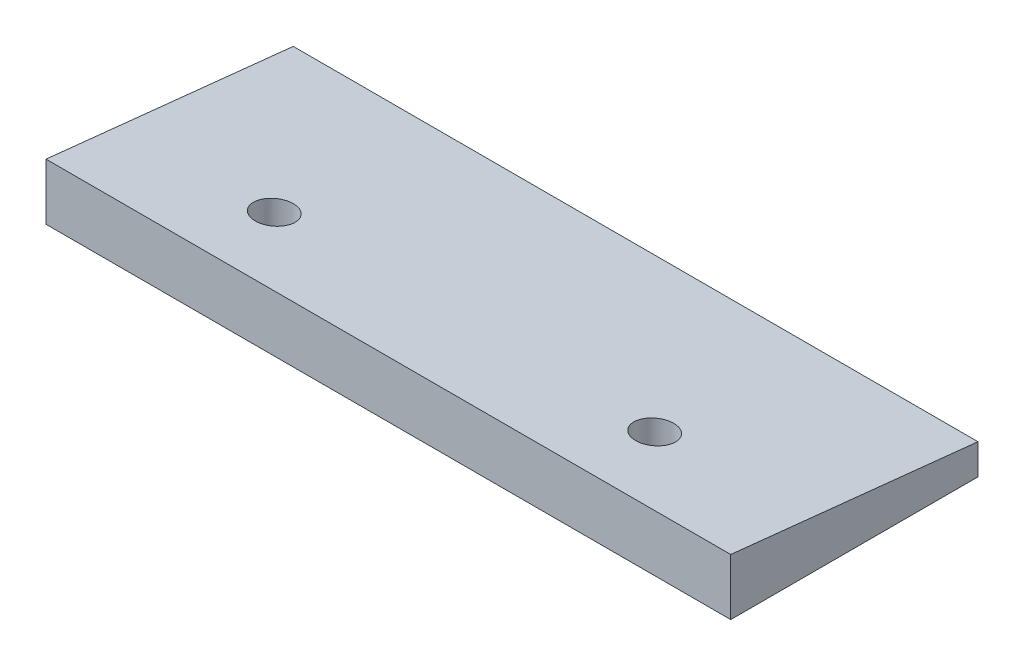
ISO-10303-21;
HEADER;
FILE_DESCRIPTION(('STEP AP214'),'2;1');
FILE_NAME('part.step','',(''),(''),'','','');
FILE_SCHEMA(('AUTOMOTIVE_DESIGN { 1 0 10303 214 1 1 1 1 }'));
ENDSEC;
DATA;
#1=APPLICATION_CONTEXT('core data for automotive mechanical design processes');
#2=APPLICATION_PROTOCOL_DEFINITION('international standard','automotive_design',2000,#1);
#3=PRODUCT_CONTEXT('',#1,'mechanical');
#4=PRODUCT('Part','Part','',(#3));
#5=PRODUCT_RELATED_PRODUCT_CATEGORY('part','',(#4));
#6=PRODUCT_DEFINITION_FORMATION('','',#4);
#7=PRODUCT_DEFINITION_CONTEXT('part definition',#1,'design');
#8=PRODUCT_DEFINITION('design','',#6,#7);
#9=PRODUCT_DEFINITION_SHAPE('','',#8);
#10=(LENGTH_UNIT() NAMED_UNIT(*) SI_UNIT(.MILLI.,.METRE.));
#11=(NAMED_UNIT(*) PLANE_ANGLE_UNIT() SI_UNIT($,.RADIAN.));
#12=(NAMED_UNIT(*) SI_UNIT($,.STERADIAN.) SOLID_ANGLE_UNIT());
#13=UNCERTAINTY_MEASURE_WITH_UNIT(LENGTH_MEASURE(1.E-05),#10,'distance_accuracy_value','');
#14=(GEOMETRIC_REPRESENTATION_CONTEXT(3) GLOBAL_UNCERTAINTY_ASSIGNED_CONTEXT((#13)) GLOBAL_UNIT_ASSIGNED_CONTEXT((#10,
#11,#12)) REPRESENTATION_CONTEXT('',''));
#15=CARTESIAN_POINT('',(0.,0.,0.));
#16=DIRECTION('',(0.,0.,1.));
#17=DIRECTION('',(1.,0.,0.));
#18=AXIS2_PLACEMENT_3D('',#15,#16,#17);
#19=CARTESIAN_POINT('',(90.,0.,65.));
#20=DIRECTION('',(0.,1.,0.));
#21=DIRECTION('',(0.,0.,1.));
#22=AXIS2_PLACEMENT_3D('',#19,#20,#21);
#23=PLANE('',#22);
#24=CARTESIAN_POINT('',(-50.,0.,45.));
#25=DIRECTION('',(0.,1.,0.));
#26=DIRECTION('',(0.,0.,1.));
#27=AXIS2_PLACEMENT_3D('',#24,#25,#26);
#28=CIRCLE('',#27,2.75);
#29=CARTESIAN_POINT('',(-50.,0.,47.75));
#30=VERTEX_POINT('',#29);
#31=EDGE_CURVE('E130',#30,#30,#28,.T.);
#32=ORIENTED_EDGE('',*,*,#31,.T.);
#33=EDGE_LOOP('',(#32));
#34=FACE_BOUND('',#33,.T.);
#35=CARTESIAN_POINT('',(50.,0.,45.));
#36=DIRECTION('',(0.,1.,0.));
#37=DIRECTION('',(0.,0.,1.));
#38=AXIS2_PLACEMENT_3D('',#35,#36,#37);
#39=CIRCLE('',#38,2.75);
#40=CARTESIAN_POINT('',(50.,0.,47.75));
#41=VERTEX_POINT('',#40);
#42=EDGE_CURVE('E116',#41,#41,#39,.T.);
#43=ORIENTED_EDGE('',*,*,#42,.T.);
#44=EDGE_LOOP('',(#43));
#45=FACE_BOUND('',#44,.T.);
#46=DIRECTION('',(0.,0.,-1.));
#47=VECTOR('',#46,1.);
#48=CARTESIAN_POINT('',(-90.,0.,65.));
#49=LINE('',#48,#47);
#50=CARTESIAN_POINT('',(-90.,0.,65.));
#51=VERTEX_POINT('',#50);
#52=CARTESIAN_POINT('',(-90.,0.,0.));
#53=VERTEX_POINT('',#52);
#54=EDGE_CURVE('E107',#51,#53,#49,.T.);
#55=ORIENTED_EDGE('',*,*,#54,.T.);
#56=DIRECTION('',(-1.,0.,0.));
#57=VECTOR('',#56,1.);
#58=CARTESIAN_POINT('',(90.,0.,0.));
#59=LINE('',#58,#57);
#60=CARTESIAN_POINT('',(90.,0.,0.));
#61=VERTEX_POINT('',#60);
#62=EDGE_CURVE('E11',#61,#53,#59,.T.);
#63=ORIENTED_EDGE('',*,*,#62,.F.);
#64=DIRECTION('',(0.,0.,-1.));
#65=VECTOR('',#64,1.);
#66=CARTESIAN_POINT('',(90.,0.,65.));
#67=LINE('',#66,#65);
#68=CARTESIAN_POINT('',(90.,0.,65.));
#69=VERTEX_POINT('',#68);
#70=EDGE_CURVE('E94',#69,#61,#67,.T.);
#71=ORIENTED_EDGE('',*,*,#70,.F.);
#72=DIRECTION('',(-1.,0.,0.));
#73=VECTOR('',#72,1.);
#74=CARTESIAN_POINT('',(90.,0.,65.));
#75=LINE('',#74,#73);
#76=EDGE_CURVE('E103',#69,#51,#75,.T.);
#77=ORIENTED_EDGE('',*,*,#76,.T.);
#78=EDGE_LOOP('',(#55,#63,#71,#77));
#79=FACE_BOUND('',#78,.T.);
#80=ADVANCED_FACE('F41',(#34,#45,#79),#23,.F.);
#81=CARTESIAN_POINT('',(90.,0.,0.));
#82=DIRECTION('',(0.,0.,1.));
#83=DIRECTION('',(1.,0.,0.));
#84=AXIS2_PLACEMENT_3D('',#81,#82,#83);
#85=PLANE('',#84);
#86=DIRECTION('',(0.,1.,0.));
#87=VECTOR('',#86,1.);
#88=CARTESIAN_POINT('',(-90.,0.,0.));
#89=LINE('',#88,#87);
#90=CARTESIAN_POINT('',(-90.,8.,0.));
#91=VERTEX_POINT('',#90);
#92=EDGE_CURVE('E98',#53,#91,#89,.T.);
#93=ORIENTED_EDGE('',*,*,#92,.T.);
#94=DIRECTION('',(-1.,0.,0.));
#95=VECTOR('',#94,1.);
#96=CARTESIAN_POINT('',(90.,8.,0.));
#97=LINE('',#96,#95);
#98=CARTESIAN_POINT('',(90.,8.,0.));
#99=VERTEX_POINT('',#98);
#100=EDGE_CURVE('E50',#99,#91,#97,.T.);
#101=ORIENTED_EDGE('',*,*,#100,.F.);
#102=DIRECTION('',(0.,1.,0.));
#103=VECTOR('',#102,1.);
#104=CARTESIAN_POINT('',(90.,0.,0.));
#105=LINE('',#104,#103);
#106=EDGE_CURVE('E89',#61,#99,#105,.T.);
#107=ORIENTED_EDGE('',*,*,#106,.F.);
#108=ORIENTED_EDGE('',*,*,#62,.T.);
#109=EDGE_LOOP('',(#93,#101,#107,#108));
#110=FACE_BOUND('',#109,.T.);
#111=ADVANCED_FACE('F97',(#110),#85,.F.);
#112=CARTESIAN_POINT('',(90.,8.,0.));
#113=DIRECTION('',(0.,-0.994521895368274,0.104528463267646));
#114=DIRECTION('',(0.,-0.104528463267646,-0.994521895368274));
#115=AXIS2_PLACEMENT_3D('',#112,#113,#114);
#116=PLANE('',#115);
#117=CARTESIAN_POINT('',(-50.,12.7296905869551,45.));
#118=DIRECTION('',(0.,-0.994521895368274,0.104528463267646));
#119=DIRECTION('',(0.,0.104528463267646,0.994521895368274));
#120=AXIS2_PLACEMENT_3D('',#117,#118,#119);
#121=ELLIPSE('',#120,5.02754139781758,5.);
#122=CARTESIAN_POINT('',(-50.,13.2552117632835,50.));
#123=VERTEX_POINT('',#122);
#124=EDGE_CURVE('E44',#123,#123,#121,.T.);
#125=ORIENTED_EDGE('',*,*,#124,.T.);
#126=EDGE_LOOP('',(#125));
#127=FACE_BOUND('',#126,.T.);
#128=CARTESIAN_POINT('',(50.,12.7296905869551,45.));
#129=DIRECTION('',(0.,-0.994521895368274,0.104528463267646));
#130=DIRECTION('',(0.,0.104528463267646,0.994521895368274));
#131=AXIS2_PLACEMENT_3D('',#128,#129,#130);
#132=ELLIPSE('',#131,5.02754139781758,5.);
#133=CARTESIAN_POINT('',(50.,13.2552117632835,50.));
#134=VERTEX_POINT('',#133);
#135=EDGE_CURVE('E110',#134,#134,#132,.T.);
#136=ORIENTED_EDGE('',*,*,#135,.T.);
#137=EDGE_LOOP('',(#136));
#138=FACE_BOUND('',#137,.T.);
#139=DIRECTION('',(0.,0.104528463267646,0.994521895368274));
#140=VECTOR('',#139,1.);
#141=CARTESIAN_POINT('',(-90.,8.,0.));
#142=LINE('',#141,#140);
#143=CARTESIAN_POINT('',(-90.,14.8317752922685,65.));
#144=VERTEX_POINT('',#143);
#145=EDGE_CURVE('E76',#91,#144,#142,.T.);
#146=ORIENTED_EDGE('',*,*,#145,.T.);
#147=DIRECTION('',(-1.,0.,0.));
#148=VECTOR('',#147,1.);
#149=CARTESIAN_POINT('',(90.,14.8317752922685,65.));
#150=LINE('',#149,#148);
#151=CARTESIAN_POINT('',(90.,14.8317752922685,65.));
#152=VERTEX_POINT('',#151);
#153=EDGE_CURVE('E99',#152,#144,#150,.T.);
#154=ORIENTED_EDGE('',*,*,#153,.F.);
#155=DIRECTION('',(0.,0.104528463267646,0.994521895368274));
#156=VECTOR('',#155,1.);
#157=CARTESIAN_POINT('',(90.,8.,0.));
#158=LINE('',#157,#156);
#159=EDGE_CURVE('E92',#99,#152,#158,.T.);
#160=ORIENTED_EDGE('',*,*,#159,.F.);
#161=ORIENTED_EDGE('',*,*,#100,.T.);
#162=EDGE_LOOP('',(#146,#154,#160,#161));
#163=FACE_BOUND('',#162,.T.);
#164=ADVANCED_FACE('F101',(#127,#138,#163),#116,.F.);
#165=CARTESIAN_POINT('',(90.,14.8317752922685,65.));
#166=DIRECTION('',(0.,0.,-1.));
#167=DIRECTION('',(-1.,0.,0.));
#168=AXIS2_PLACEMENT_3D('',#165,#166,#167);
#169=PLANE('',#168);
#170=DIRECTION('',(0.,-1.,0.));
#171=VECTOR('',#170,1.);
#172=CARTESIAN_POINT('',(-90.,14.8317752922685,65.));
#173=LINE('',#172,#171);
#174=EDGE_CURVE('E82',#144,#51,#173,.T.);
#175=ORIENTED_EDGE('',*,*,#174,.T.);
#176=ORIENTED_EDGE('',*,*,#76,.F.);
#177=DIRECTION('',(0.,-1.,0.));
#178=VECTOR('',#177,1.);
#179=CARTESIAN_POINT('',(90.,14.8317752922685,65.));
#180=LINE('',#179,#178);
#181=EDGE_CURVE('E59',#152,#69,#180,.T.);
#182=ORIENTED_EDGE('',*,*,#181,.F.);
#183=ORIENTED_EDGE('',*,*,#153,.T.);
#184=EDGE_LOOP('',(#175,#176,#182,#183));
#185=FACE_BOUND('',#184,.T.);
#186=ADVANCED_FACE('F152',(#185),#169,.F.);
#187=CARTESIAN_POINT('',(90.,0.,0.));
#188=DIRECTION('',(1.,0.,0.));
#189=DIRECTION('',(0.,0.,-1.));
#190=AXIS2_PLACEMENT_3D('',#187,#188,#189);
#191=PLANE('',#190);
#192=ORIENTED_EDGE('',*,*,#70,.T.);
#193=ORIENTED_EDGE('',*,*,#106,.T.);
#194=ORIENTED_EDGE('',*,*,#159,.T.);
#195=ORIENTED_EDGE('',*,*,#181,.T.);
#196=EDGE_LOOP('',(#192,#193,#194,#195));
#197=FACE_BOUND('',#196,.T.);
#198=ADVANCED_FACE('F90',(#197),#191,.T.);
#199=CARTESIAN_POINT('',(-90.,0.,0.));
#200=DIRECTION('',(1.,0.,0.));
#201=DIRECTION('',(0.,0.,-1.));
#202=AXIS2_PLACEMENT_3D('',#199,#200,#201);
#203=PLANE('',#202);
#204=ORIENTED_EDGE('',*,*,#54,.F.);
#205=ORIENTED_EDGE('',*,*,#174,.F.);
#206=ORIENTED_EDGE('',*,*,#145,.F.);
#207=ORIENTED_EDGE('',*,*,#92,.F.);
#208=EDGE_LOOP('',(#204,#205,#206,#207));
#209=FACE_BOUND('',#208,.T.);
#210=ADVANCED_FACE('F169',(#209),#203,.F.);
#211=CARTESIAN_POINT('',(50.,20.,45.));
#212=DIRECTION('',(0.,1.,0.));
#213=DIRECTION('',(0.,0.,1.));
#214=AXIS2_PLACEMENT_3D('',#211,#212,#213);
#215=CYLINDRICAL_SURFACE('',#214,5.);
#216=CARTESIAN_POINT('',(50.,5.,45.));
#217=DIRECTION('',(0.,1.,0.));
#218=DIRECTION('',(0.,0.,1.));
#219=AXIS2_PLACEMENT_3D('',#216,#217,#218);
#220=CIRCLE('',#219,5.);
#221=CARTESIAN_POINT('',(50.,5.,50.));
#222=VERTEX_POINT('',#221);
#223=EDGE_CURVE('E125',#222,#222,#220,.T.);
#224=ORIENTED_EDGE('',*,*,#223,.F.);
#225=EDGE_LOOP('',(#224));
#226=FACE_BOUND('',#225,.T.);
#227=ORIENTED_EDGE('',*,*,#135,.F.);
#228=EDGE_LOOP('',(#227));
#229=FACE_BOUND('',#228,.T.);
#230=ADVANCED_FACE('F170',(#226,#229),#215,.F.);
#231=CARTESIAN_POINT('',(50.,20.,45.));
#232=DIRECTION('',(0.,1.,0.));
#233=DIRECTION('',(0.,0.,1.));
#234=AXIS2_PLACEMENT_3D('',#231,#232,#233);
#235=CYLINDRICAL_SURFACE('',#234,2.75);
#236=ORIENTED_EDGE('',*,*,#42,.F.);
#237=EDGE_LOOP('',(#236));
#238=FACE_BOUND('',#237,.T.);
#239=CARTESIAN_POINT('',(50.,5.,45.));
#240=DIRECTION('',(0.,1.,0.));
#241=DIRECTION('',(0.,0.,1.));
#242=AXIS2_PLACEMENT_3D('',#239,#240,#241);
#243=CIRCLE('',#242,2.75);
#244=CARTESIAN_POINT('',(50.,5.,47.75));
#245=VERTEX_POINT('',#244);
#246=EDGE_CURVE('E120',#245,#245,#243,.T.);
#247=ORIENTED_EDGE('',*,*,#246,.T.);
#248=EDGE_LOOP('',(#247));
#249=FACE_BOUND('',#248,.T.);
#250=ADVANCED_FACE('F175',(#238,#249),#235,.F.);
#251=CARTESIAN_POINT('',(52.75,5.,45.));
#252=DIRECTION('',(0.,-1.,0.));
#253=DIRECTION('',(0.,0.,-1.));
#254=AXIS2_PLACEMENT_3D('',#251,#252,#253);
#255=PLANE('',#254);
#256=ORIENTED_EDGE('',*,*,#246,.F.);
#257=EDGE_LOOP('',(#256));
#258=FACE_BOUND('',#257,.T.);
#259=ORIENTED_EDGE('',*,*,#223,.T.);
#260=EDGE_LOOP('',(#259));
#261=FACE_BOUND('',#260,.T.);
#262=ADVANCED_FACE('F146',(#258,#261),#255,.F.);
#263=CARTESIAN_POINT('',(-50.,20.,45.));
#264=DIRECTION('',(0.,1.,0.));
#265=DIRECTION('',(0.,0.,1.));
#266=AXIS2_PLACEMENT_3D('',#263,#264,#265);
#267=CYLINDRICAL_SURFACE('',#266,5.);
#268=CARTESIAN_POINT('',(-50.,5.,45.));
#269=DIRECTION('',(0.,1.,0.));
#270=DIRECTION('',(0.,0.,1.));
#271=AXIS2_PLACEMENT_3D('',#268,#269,#270);
#272=CIRCLE('',#271,5.);
#273=CARTESIAN_POINT('',(-50.,5.,50.));
#274=VERTEX_POINT('',#273);
#275=EDGE_CURVE('E136',#274,#274,#272,.T.);
#276=ORIENTED_EDGE('',*,*,#275,.F.);
#277=EDGE_LOOP('',(#276));
#278=FACE_BOUND('',#277,.T.);
#279=ORIENTED_EDGE('',*,*,#124,.F.);
#280=EDGE_LOOP('',(#279));
#281=FACE_BOUND('',#280,.T.);
#282=ADVANCED_FACE('F142',(#278,#281),#267,.F.);
#283=CARTESIAN_POINT('',(-50.,20.,45.));
#284=DIRECTION('',(0.,1.,0.));
#285=DIRECTION('',(0.,0.,1.));
#286=AXIS2_PLACEMENT_3D('',#283,#284,#285);
#287=CYLINDRICAL_SURFACE('',#286,2.75);
#288=ORIENTED_EDGE('',*,*,#31,.F.);
#289=EDGE_LOOP('',(#288));
#290=FACE_BOUND('',#289,.T.);
#291=CARTESIAN_POINT('',(-50.,5.,45.));
#292=DIRECTION('',(0.,1.,0.));
#293=DIRECTION('',(0.,0.,1.));
#294=AXIS2_PLACEMENT_3D('',#291,#292,#293);
#295=CIRCLE('',#294,2.75);
#296=CARTESIAN_POINT('',(-50.,5.,47.75));
#297=VERTEX_POINT('',#296);
#298=EDGE_CURVE('E133',#297,#297,#295,.T.);
#299=ORIENTED_EDGE('',*,*,#298,.T.);
#300=EDGE_LOOP('',(#299));
#301=FACE_BOUND('',#300,.T.);
#302=ADVANCED_FACE('F145',(#290,#301),#287,.F.);
#303=CARTESIAN_POINT('',(-47.25,5.,45.));
#304=DIRECTION('',(0.,-1.,0.));
#305=DIRECTION('',(0.,0.,-1.));
#306=AXIS2_PLACEMENT_3D('',#303,#304,#305);
#307=PLANE('',#306);
#308=ORIENTED_EDGE('',*,*,#298,.F.);
#309=EDGE_LOOP('',(#308));
#310=FACE_BOUND('',#309,.T.);
#311=ORIENTED_EDGE('',*,*,#275,.T.);
#312=EDGE_LOOP('',(#311));
#313=FACE_BOUND('',#312,.T.);
#314=ADVANCED_FACE('F140',(#310,#313),#307,.F.);
#315=CLOSED_SHELL('',(#80,#111,#164,#186,#198,#210,#230,#250,#262,#282,#302,#314));
#316=MANIFOLD_SOLID_BREP('B2',#315);
#317=ADVANCED_BREP_SHAPE_REPRESENTATION('',(#18,#316),#14);
#318=SHAPE_DEFINITION_REPRESENTATION(#9,#317);
ENDSEC;
END-ISO-10303-21;
